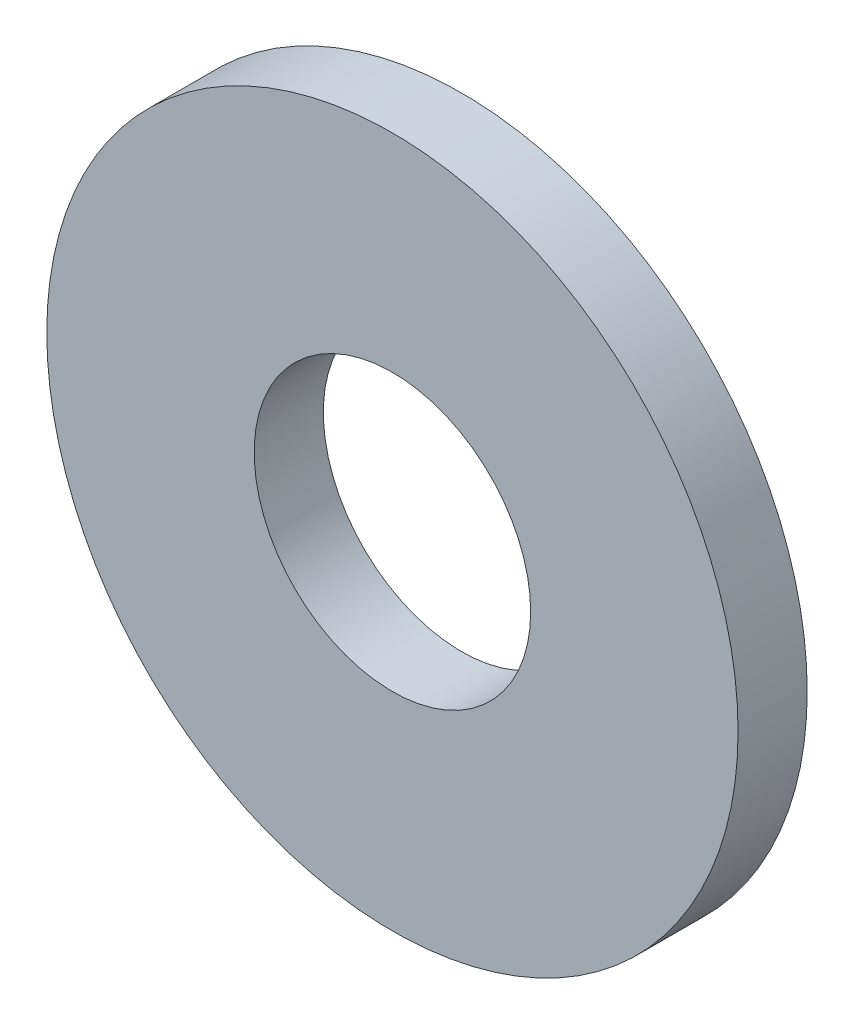
ISO-10303-21;
HEADER;
FILE_DESCRIPTION(('STEP AP214'),'2;1');
FILE_NAME('part.step','',(''),(''),'','','');
FILE_SCHEMA(('AUTOMOTIVE_DESIGN { 1 0 10303 214 1 1 1 1 }'));
ENDSEC;
DATA;
#1=APPLICATION_CONTEXT('core data for automotive mechanical design processes');
#2=APPLICATION_PROTOCOL_DEFINITION('international standard','automotive_design',2000,#1);
#3=PRODUCT_CONTEXT('',#1,'mechanical');
#4=PRODUCT('Part','Part','',(#3));
#5=PRODUCT_RELATED_PRODUCT_CATEGORY('part','',(#4));
#6=PRODUCT_DEFINITION_FORMATION('','',#4);
#7=PRODUCT_DEFINITION_CONTEXT('part definition',#1,'design');
#8=PRODUCT_DEFINITION('design','',#6,#7);
#9=PRODUCT_DEFINITION_SHAPE('','',#8);
#10=(LENGTH_UNIT() NAMED_UNIT(*) SI_UNIT(.MILLI.,.METRE.));
#11=(NAMED_UNIT(*) PLANE_ANGLE_UNIT() SI_UNIT($,.RADIAN.));
#12=(NAMED_UNIT(*) SI_UNIT($,.STERADIAN.) SOLID_ANGLE_UNIT());
#13=UNCERTAINTY_MEASURE_WITH_UNIT(LENGTH_MEASURE(1.E-05),#10,'distance_accuracy_value','');
#14=(GEOMETRIC_REPRESENTATION_CONTEXT(3) GLOBAL_UNCERTAINTY_ASSIGNED_CONTEXT((#13)) GLOBAL_UNIT_ASSIGNED_CONTEXT((#10,
#11,#12)) REPRESENTATION_CONTEXT('',''));
#15=CARTESIAN_POINT('',(0.,0.,0.));
#16=DIRECTION('',(0.,0.,1.));
#17=DIRECTION('',(1.,0.,0.));
#18=AXIS2_PLACEMENT_3D('',#15,#16,#17);
#19=CARTESIAN_POINT('',(0.,0.,0.5));
#20=DIRECTION('',(0.,0.,1.));
#21=DIRECTION('',(1.,0.,0.));
#22=AXIS2_PLACEMENT_3D('',#19,#20,#21);
#23=PLANE('',#22);
#24=CARTESIAN_POINT('',(0.,0.,0.5));
#25=DIRECTION('',(0.,0.,1.));
#26=DIRECTION('',(1.,0.,0.));
#27=AXIS2_PLACEMENT_3D('',#24,#25,#26);
#28=CIRCLE('',#27,2.5);
#29=CARTESIAN_POINT('',(2.5,0.,0.5));
#30=VERTEX_POINT('',#29);
#31=EDGE_CURVE('E10',#30,#30,#28,.T.);
#32=ORIENTED_EDGE('',*,*,#31,.T.);
#33=EDGE_LOOP('',(#32));
#34=FACE_BOUND('',#33,.T.);
#35=CARTESIAN_POINT('',(0.,0.,0.5));
#36=DIRECTION('',(0.,0.,1.));
#37=DIRECTION('',(1.,0.,0.));
#38=AXIS2_PLACEMENT_3D('',#35,#36,#37);
#39=CIRCLE('',#38,1.);
#40=CARTESIAN_POINT('',(1.,0.,0.5));
#41=VERTEX_POINT('',#40);
#42=EDGE_CURVE('E42',#41,#41,#39,.T.);
#43=ORIENTED_EDGE('',*,*,#42,.F.);
#44=EDGE_LOOP('',(#43));
#45=FACE_BOUND('',#44,.T.);
#46=ADVANCED_FACE('F31',(#34,#45),#23,.T.);
#47=CARTESIAN_POINT('',(0.,0.,0.));
#48=DIRECTION('',(0.,0.,1.));
#49=DIRECTION('',(1.,0.,0.));
#50=AXIS2_PLACEMENT_3D('',#47,#48,#49);
#51=PLANE('',#50);
#52=CARTESIAN_POINT('',(0.,0.,0.));
#53=DIRECTION('',(0.,0.,1.));
#54=DIRECTION('',(1.,0.,0.));
#55=AXIS2_PLACEMENT_3D('',#52,#53,#54);
#56=CIRCLE('',#55,2.5);
#57=CARTESIAN_POINT('',(2.5,0.,0.));
#58=VERTEX_POINT('',#57);
#59=EDGE_CURVE('E35',#58,#58,#56,.T.);
#60=ORIENTED_EDGE('',*,*,#59,.F.);
#61=EDGE_LOOP('',(#60));
#62=FACE_BOUND('',#61,.T.);
#63=CARTESIAN_POINT('',(0.,0.,0.));
#64=DIRECTION('',(0.,0.,1.));
#65=DIRECTION('',(1.,0.,0.));
#66=AXIS2_PLACEMENT_3D('',#63,#64,#65);
#67=CIRCLE('',#66,1.);
#68=CARTESIAN_POINT('',(1.,0.,0.));
#69=VERTEX_POINT('',#68);
#70=EDGE_CURVE('E44',#69,#69,#67,.T.);
#71=ORIENTED_EDGE('',*,*,#70,.T.);
#72=EDGE_LOOP('',(#71));
#73=FACE_BOUND('',#72,.T.);
#74=ADVANCED_FACE('F54',(#62,#73),#51,.F.);
#75=CARTESIAN_POINT('',(0.,0.,0.5));
#76=DIRECTION('',(0.,0.,-1.));
#77=DIRECTION('',(-1.,0.,0.));
#78=AXIS2_PLACEMENT_3D('',#75,#76,#77);
#79=CYLINDRICAL_SURFACE('',#78,2.5);
#80=ORIENTED_EDGE('',*,*,#31,.F.);
#81=EDGE_LOOP('',(#80));
#82=FACE_BOUND('',#81,.T.);
#83=ORIENTED_EDGE('',*,*,#59,.T.);
#84=EDGE_LOOP('',(#83));
#85=FACE_BOUND('',#84,.T.);
#86=ADVANCED_FACE('F33',(#82,#85),#79,.T.);
#87=CARTESIAN_POINT('',(0.,0.,0.5));
#88=DIRECTION('',(0.,0.,-1.));
#89=DIRECTION('',(-1.,0.,0.));
#90=AXIS2_PLACEMENT_3D('',#87,#88,#89);
#91=CYLINDRICAL_SURFACE('',#90,1.);
#92=ORIENTED_EDGE('',*,*,#42,.T.);
#93=EDGE_LOOP('',(#92));
#94=FACE_BOUND('',#93,.T.);
#95=ORIENTED_EDGE('',*,*,#70,.F.);
#96=EDGE_LOOP('',(#95));
#97=FACE_BOUND('',#96,.T.);
#98=ADVANCED_FACE('F50',(#94,#97),#91,.F.);
#99=CLOSED_SHELL('',(#46,#74,#86,#98));
#100=MANIFOLD_SOLID_BREP('B2',#99);
#101=ADVANCED_BREP_SHAPE_REPRESENTATION('',(#18,#100),#14);
#102=SHAPE_DEFINITION_REPRESENTATION(#9,#101);
ENDSEC;
END-ISO-10303-21;
